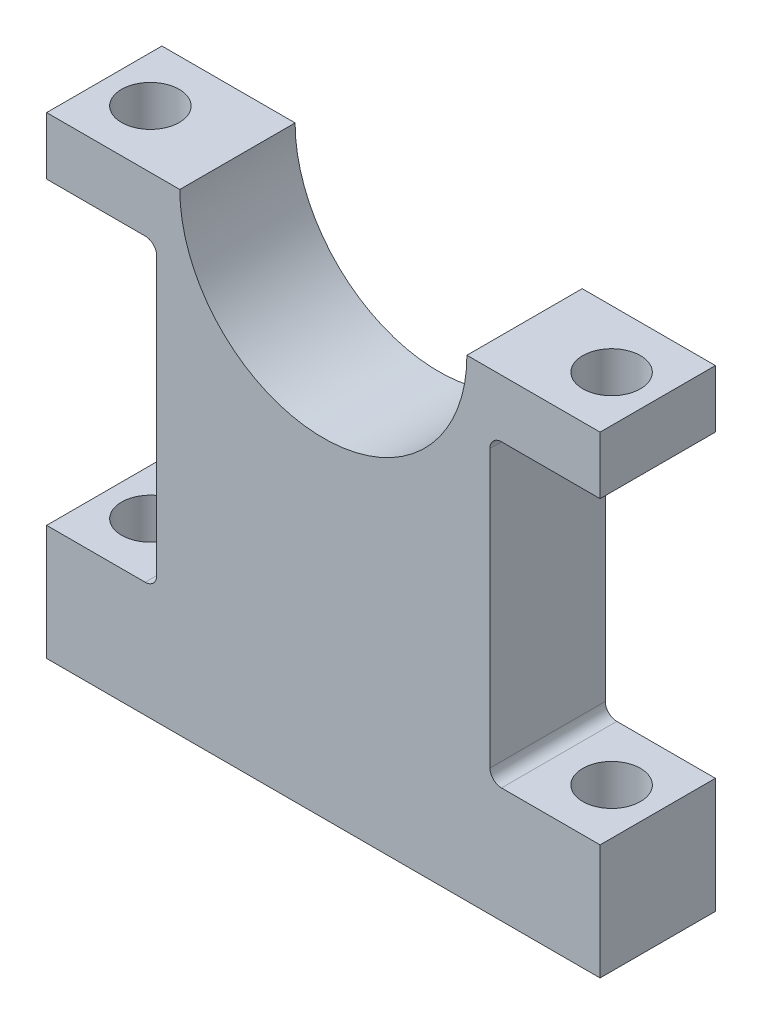
ISO-10303-21;
HEADER;
FILE_DESCRIPTION(('STEP AP214'),'2;1');
FILE_NAME('part.step','',(''),(''),'','','');
FILE_SCHEMA(('AUTOMOTIVE_DESIGN { 1 0 10303 214 1 1 1 1 }'));
ENDSEC;
DATA;
#1=APPLICATION_CONTEXT('core data for automotive mechanical design processes');
#2=APPLICATION_PROTOCOL_DEFINITION('international standard','automotive_design',2000,#1);
#3=PRODUCT_CONTEXT('',#1,'mechanical');
#4=PRODUCT('Part','Part','',(#3));
#5=PRODUCT_RELATED_PRODUCT_CATEGORY('part','',(#4));
#6=PRODUCT_DEFINITION_FORMATION('','',#4);
#7=PRODUCT_DEFINITION_CONTEXT('part definition',#1,'design');
#8=PRODUCT_DEFINITION('design','',#6,#7);
#9=PRODUCT_DEFINITION_SHAPE('','',#8);
#10=(LENGTH_UNIT() NAMED_UNIT(*) SI_UNIT(.MILLI.,.METRE.));
#11=(NAMED_UNIT(*) PLANE_ANGLE_UNIT() SI_UNIT($,.RADIAN.));
#12=(NAMED_UNIT(*) SI_UNIT($,.STERADIAN.) SOLID_ANGLE_UNIT());
#13=UNCERTAINTY_MEASURE_WITH_UNIT(LENGTH_MEASURE(1.E-05),#10,'distance_accuracy_value','');
#14=(GEOMETRIC_REPRESENTATION_CONTEXT(3) GLOBAL_UNCERTAINTY_ASSIGNED_CONTEXT((#13)) GLOBAL_UNIT_ASSIGNED_CONTEXT((#10,
#11,#12)) REPRESENTATION_CONTEXT('',''));
#15=CARTESIAN_POINT('',(0.,0.,0.));
#16=DIRECTION('',(0.,0.,1.));
#17=DIRECTION('',(1.,0.,0.));
#18=AXIS2_PLACEMENT_3D('',#15,#16,#17);
#19=CARTESIAN_POINT('',(0.,0.,0.));
#20=DIRECTION('',(0.,1.,0.));
#21=DIRECTION('',(0.,0.,1.));
#22=AXIS2_PLACEMENT_3D('',#19,#20,#21);
#23=PLANE('',#22);
#24=DIRECTION('',(0.,0.,1.));
#25=VECTOR('',#24,1.);
#26=CARTESIAN_POINT('',(-12.45,0.,-11.));
#27=LINE('',#26,#25);
#28=CARTESIAN_POINT('',(-12.45,0.,-5.));
#29=VERTEX_POINT('',#28);
#30=CARTESIAN_POINT('',(-12.45,0.,5.));
#31=VERTEX_POINT('',#30);
#32=EDGE_CURVE('E178',#29,#31,#27,.T.);
#33=ORIENTED_EDGE('',*,*,#32,.F.);
#34=DIRECTION('',(-1.,0.,0.));
#35=VECTOR('',#34,1.);
#36=CARTESIAN_POINT('',(-24.,0.,-5.));
#37=LINE('',#36,#35);
#38=CARTESIAN_POINT('',(-24.,0.,-5.));
#39=VERTEX_POINT('',#38);
#40=EDGE_CURVE('E351',#29,#39,#37,.T.);
#41=ORIENTED_EDGE('',*,*,#40,.T.);
#42=DIRECTION('',(0.,0.,1.));
#43=VECTOR('',#42,1.);
#44=CARTESIAN_POINT('',(-24.,0.,-5.));
#45=LINE('',#44,#43);
#46=CARTESIAN_POINT('',(-24.,0.,5.));
#47=VERTEX_POINT('',#46);
#48=EDGE_CURVE('E190',#39,#47,#45,.T.);
#49=ORIENTED_EDGE('',*,*,#48,.T.);
#50=DIRECTION('',(1.,0.,0.));
#51=VECTOR('',#50,1.);
#52=CARTESIAN_POINT('',(-24.,0.,5.));
#53=LINE('',#52,#51);
#54=EDGE_CURVE('E166',#47,#31,#53,.T.);
#55=ORIENTED_EDGE('',*,*,#54,.T.);
#56=EDGE_LOOP('',(#33,#41,#49,#55));
#57=FACE_BOUND('',#56,.T.);
#58=CARTESIAN_POINT('',(-20.,0.,0.));
#59=DIRECTION('',(0.,1.,0.));
#60=DIRECTION('',(0.,0.,1.));
#61=AXIS2_PLACEMENT_3D('',#58,#59,#60);
#62=CIRCLE('',#61,2.5);
#63=CARTESIAN_POINT('',(-20.,0.,2.5));
#64=VERTEX_POINT('',#63);
#65=EDGE_CURVE('E389',#64,#64,#62,.T.);
#66=ORIENTED_EDGE('',*,*,#65,.F.);
#67=EDGE_LOOP('',(#66));
#68=FACE_BOUND('',#67,.T.);
#69=ADVANCED_FACE('F39',(#57,#68),#23,.T.);
#70=CARTESIAN_POINT('',(0.,0.,5.));
#71=DIRECTION('',(0.,0.,-1.));
#72=DIRECTION('',(-1.,0.,0.));
#73=AXIS2_PLACEMENT_3D('',#70,#71,#72);
#74=CYLINDRICAL_SURFACE('',#73,12.45);
#75=CARTESIAN_POINT('',(0.,0.,5.));
#76=DIRECTION('',(0.,0.,-1.));
#77=DIRECTION('',(1.,0.,0.));
#78=AXIS2_PLACEMENT_3D('',#75,#76,#77);
#79=CIRCLE('',#78,12.45);
#80=CARTESIAN_POINT('',(12.45,0.,5.));
#81=VERTEX_POINT('',#80);
#82=EDGE_CURVE('E162',#81,#31,#79,.T.);
#83=ORIENTED_EDGE('',*,*,#82,.F.);
#84=DIRECTION('',(0.,0.,1.));
#85=VECTOR('',#84,1.);
#86=CARTESIAN_POINT('',(12.45,0.,-11.));
#87=LINE('',#86,#85);
#88=CARTESIAN_POINT('',(12.45,0.,-5.));
#89=VERTEX_POINT('',#88);
#90=EDGE_CURVE('E185',#81,#89,#87,.F.);
#91=ORIENTED_EDGE('',*,*,#90,.T.);
#92=CARTESIAN_POINT('',(0.,0.,-5.));
#93=DIRECTION('',(0.,0.,-1.));
#94=DIRECTION('',(1.,0.,0.));
#95=AXIS2_PLACEMENT_3D('',#92,#93,#94);
#96=CIRCLE('',#95,12.45);
#97=EDGE_CURVE('E180',#89,#29,#96,.T.);
#98=ORIENTED_EDGE('',*,*,#97,.T.);
#99=ORIENTED_EDGE('',*,*,#32,.T.);
#100=EDGE_LOOP('',(#83,#91,#98,#99));
#101=FACE_BOUND('',#100,.T.);
#102=ADVANCED_FACE('F179',(#101),#74,.F.);
#103=CARTESIAN_POINT('',(12.45,-41.,5.));
#104=DIRECTION('',(0.,1.,0.));
#105=DIRECTION('',(0.,0.,1.));
#106=AXIS2_PLACEMENT_3D('',#103,#104,#105);
#107=PLANE('',#106);
#108=DIRECTION('',(1.,0.,0.));
#109=VECTOR('',#108,1.);
#110=CARTESIAN_POINT('',(12.45,-41.,-5.));
#111=LINE('',#110,#109);
#112=CARTESIAN_POINT('',(-24.,-41.,-5.));
#113=VERTEX_POINT('',#112);
#114=CARTESIAN_POINT('',(24.,-41.,-5.));
#115=VERTEX_POINT('',#114);
#116=EDGE_CURVE('E175',#113,#115,#111,.T.);
#117=ORIENTED_EDGE('',*,*,#116,.T.);
#118=DIRECTION('',(0.,0.,1.));
#119=VECTOR('',#118,1.);
#120=CARTESIAN_POINT('',(24.,-41.,5.));
#121=LINE('',#120,#119);
#122=CARTESIAN_POINT('',(24.,-41.,5.));
#123=VERTEX_POINT('',#122);
#124=EDGE_CURVE('E230',#115,#123,#121,.T.);
#125=ORIENTED_EDGE('',*,*,#124,.T.);
#126=DIRECTION('',(1.,0.,0.));
#127=VECTOR('',#126,1.);
#128=CARTESIAN_POINT('',(12.45,-41.,5.));
#129=LINE('',#128,#127);
#130=CARTESIAN_POINT('',(-24.,-41.,5.));
#131=VERTEX_POINT('',#130);
#132=EDGE_CURVE('E174',#131,#123,#129,.T.);
#133=ORIENTED_EDGE('',*,*,#132,.F.);
#134=DIRECTION('',(0.,0.,-1.));
#135=VECTOR('',#134,1.);
#136=CARTESIAN_POINT('',(-24.,-41.,5.));
#137=LINE('',#136,#135);
#138=EDGE_CURVE('E239',#131,#113,#137,.T.);
#139=ORIENTED_EDGE('',*,*,#138,.T.);
#140=EDGE_LOOP('',(#117,#125,#133,#139));
#141=FACE_BOUND('',#140,.T.);
#142=CARTESIAN_POINT('',(20.,-41.,0.));
#143=DIRECTION('',(0.,-1.,0.));
#144=DIRECTION('',(0.,0.,-1.));
#145=AXIS2_PLACEMENT_3D('',#142,#143,#144);
#146=CIRCLE('',#145,2.5);
#147=CARTESIAN_POINT('',(20.,-41.,-2.5));
#148=VERTEX_POINT('',#147);
#149=EDGE_CURVE('E222',#148,#148,#146,.T.);
#150=ORIENTED_EDGE('',*,*,#149,.F.);
#151=EDGE_LOOP('',(#150));
#152=FACE_BOUND('',#151,.T.);
#153=CARTESIAN_POINT('',(-20.,-41.,0.));
#154=DIRECTION('',(0.,-1.,0.));
#155=DIRECTION('',(0.,0.,1.));
#156=AXIS2_PLACEMENT_3D('',#153,#154,#155);
#157=CIRCLE('',#156,2.5);
#158=CARTESIAN_POINT('',(-20.,-41.,2.5));
#159=VERTEX_POINT('',#158);
#160=EDGE_CURVE('E205',#159,#159,#157,.T.);
#161=ORIENTED_EDGE('',*,*,#160,.F.);
#162=EDGE_LOOP('',(#161));
#163=FACE_BOUND('',#162,.T.);
#164=ADVANCED_FACE('F404',(#141,#152,#163),#107,.F.);
#165=CARTESIAN_POINT('',(0.,0.,5.));
#166=DIRECTION('',(0.,0.,1.));
#167=DIRECTION('',(1.,0.,0.));
#168=AXIS2_PLACEMENT_3D('',#165,#166,#167);
#169=PLANE('',#168);
#170=ORIENTED_EDGE('',*,*,#82,.T.);
#171=ORIENTED_EDGE('',*,*,#54,.F.);
#172=DIRECTION('',(0.,1.,0.));
#173=VECTOR('',#172,1.);
#174=CARTESIAN_POINT('',(-24.,-5.,5.));
#175=LINE('',#174,#173);
#176=CARTESIAN_POINT('',(-24.,-5.,5.));
#177=VERTEX_POINT('',#176);
#178=EDGE_CURVE('E206',#177,#47,#175,.T.);
#179=ORIENTED_EDGE('',*,*,#178,.F.);
#180=DIRECTION('',(1.,0.,0.));
#181=VECTOR('',#180,1.);
#182=CARTESIAN_POINT('',(-24.,-5.,5.));
#183=LINE('',#182,#181);
#184=CARTESIAN_POINT('',(-15.45,-5.,5.));
#185=VERTEX_POINT('',#184);
#186=EDGE_CURVE('E217',#177,#185,#183,.T.);
#187=ORIENTED_EDGE('',*,*,#186,.T.);
#188=CARTESIAN_POINT('',(-15.45,-6.,5.));
#189=DIRECTION('',(0.,0.,1.));
#190=DIRECTION('',(1.,0.,0.));
#191=AXIS2_PLACEMENT_3D('',#188,#189,#190);
#192=CIRCLE('',#191,1.);
#193=CARTESIAN_POINT('',(-14.45,-6.,5.));
#194=VERTEX_POINT('',#193);
#195=EDGE_CURVE('E48',#185,#194,#192,.F.);
#196=ORIENTED_EDGE('',*,*,#195,.T.);
#197=DIRECTION('',(0.,-1.,0.));
#198=VECTOR('',#197,1.);
#199=CARTESIAN_POINT('',(-14.45,-5.,5.));
#200=LINE('',#199,#198);
#201=CARTESIAN_POINT('',(-14.45,-30.,5.));
#202=VERTEX_POINT('',#201);
#203=EDGE_CURVE('E374',#194,#202,#200,.T.);
#204=ORIENTED_EDGE('',*,*,#203,.T.);
#205=CARTESIAN_POINT('',(-15.45,-30.,5.));
#206=DIRECTION('',(0.,0.,1.));
#207=DIRECTION('',(1.,0.,0.));
#208=AXIS2_PLACEMENT_3D('',#205,#206,#207);
#209=CIRCLE('',#208,1.);
#210=CARTESIAN_POINT('',(-15.45,-31.,5.));
#211=VERTEX_POINT('',#210);
#212=EDGE_CURVE('E303',#202,#211,#209,.F.);
#213=ORIENTED_EDGE('',*,*,#212,.T.);
#214=DIRECTION('',(-1.,0.,0.));
#215=VECTOR('',#214,1.);
#216=CARTESIAN_POINT('',(-24.,-31.,5.));
#217=LINE('',#216,#215);
#218=CARTESIAN_POINT('',(-24.,-31.,5.));
#219=VERTEX_POINT('',#218);
#220=EDGE_CURVE('E238',#211,#219,#217,.T.);
#221=ORIENTED_EDGE('',*,*,#220,.T.);
#222=DIRECTION('',(0.,-1.,0.));
#223=VECTOR('',#222,1.);
#224=CARTESIAN_POINT('',(-24.,-31.,5.));
#225=LINE('',#224,#223);
#226=EDGE_CURVE('E268',#219,#131,#225,.T.);
#227=ORIENTED_EDGE('',*,*,#226,.T.);
#228=ORIENTED_EDGE('',*,*,#132,.T.);
#229=DIRECTION('',(0.,-1.,0.));
#230=VECTOR('',#229,1.);
#231=CARTESIAN_POINT('',(24.,-31.,5.));
#232=LINE('',#231,#230);
#233=CARTESIAN_POINT('',(24.,-31.,5.));
#234=VERTEX_POINT('',#233);
#235=EDGE_CURVE('E253',#234,#123,#232,.T.);
#236=ORIENTED_EDGE('',*,*,#235,.F.);
#237=CARTESIAN_POINT('',(15.45,-31.,5.));
#238=VERTEX_POINT('',#237);
#239=EDGE_CURVE('E240',#234,#238,#217,.T.);
#240=ORIENTED_EDGE('',*,*,#239,.T.);
#241=CARTESIAN_POINT('',(15.45,-30.,5.));
#242=DIRECTION('',(0.,0.,1.));
#243=DIRECTION('',(1.,0.,0.));
#244=AXIS2_PLACEMENT_3D('',#241,#242,#243);
#245=CIRCLE('',#244,1.);
#246=CARTESIAN_POINT('',(14.45,-30.,5.));
#247=VERTEX_POINT('',#246);
#248=EDGE_CURVE('E297',#238,#247,#245,.F.);
#249=ORIENTED_EDGE('',*,*,#248,.T.);
#250=DIRECTION('',(0.,1.,0.));
#251=VECTOR('',#250,1.);
#252=CARTESIAN_POINT('',(14.45,-4.99999999999999,5.));
#253=LINE('',#252,#251);
#254=CARTESIAN_POINT('',(14.45,-6.,5.));
#255=VERTEX_POINT('',#254);
#256=EDGE_CURVE('E384',#247,#255,#253,.T.);
#257=ORIENTED_EDGE('',*,*,#256,.T.);
#258=CARTESIAN_POINT('',(15.45,-6.,5.));
#259=DIRECTION('',(0.,0.,1.));
#260=DIRECTION('',(1.,0.,0.));
#261=AXIS2_PLACEMENT_3D('',#258,#259,#260);
#262=CIRCLE('',#261,1.);
#263=CARTESIAN_POINT('',(15.45,-5.,5.));
#264=VERTEX_POINT('',#263);
#265=EDGE_CURVE('E322',#255,#264,#262,.F.);
#266=ORIENTED_EDGE('',*,*,#265,.T.);
#267=CARTESIAN_POINT('',(24.,-5.,5.));
#268=VERTEX_POINT('',#267);
#269=EDGE_CURVE('E332',#264,#268,#183,.T.);
#270=ORIENTED_EDGE('',*,*,#269,.T.);
#271=DIRECTION('',(0.,1.,0.));
#272=VECTOR('',#271,1.);
#273=CARTESIAN_POINT('',(24.,-5.,5.));
#274=LINE('',#273,#272);
#275=CARTESIAN_POINT('',(24.,0.,5.));
#276=VERTEX_POINT('',#275);
#277=EDGE_CURVE('E202',#268,#276,#274,.T.);
#278=ORIENTED_EDGE('',*,*,#277,.T.);
#279=EDGE_CURVE('E169',#81,#276,#53,.T.);
#280=ORIENTED_EDGE('',*,*,#279,.F.);
#281=EDGE_LOOP('',(#170,#171,#179,#187,#196,#204,#213,#221,#227,#228,#236,#240,#249,#257,#266,
#270,#278,#280));
#282=FACE_BOUND('',#281,.T.);
#283=ADVANCED_FACE('F164',(#282),#169,.T.);
#284=CARTESIAN_POINT('',(0.,0.,-5.));
#285=DIRECTION('',(0.,0.,1.));
#286=DIRECTION('',(1.,0.,0.));
#287=AXIS2_PLACEMENT_3D('',#284,#285,#286);
#288=PLANE('',#287);
#289=ORIENTED_EDGE('',*,*,#40,.F.);
#290=ORIENTED_EDGE('',*,*,#97,.F.);
#291=CARTESIAN_POINT('',(24.,0.,-5.));
#292=VERTEX_POINT('',#291);
#293=EDGE_CURVE('E353',#292,#89,#37,.T.);
#294=ORIENTED_EDGE('',*,*,#293,.F.);
#295=DIRECTION('',(0.,1.,0.));
#296=VECTOR('',#295,1.);
#297=CARTESIAN_POINT('',(24.,-5.,-5.));
#298=LINE('',#297,#296);
#299=CARTESIAN_POINT('',(24.,-5.,-5.));
#300=VERTEX_POINT('',#299);
#301=EDGE_CURVE('E213',#300,#292,#298,.T.);
#302=ORIENTED_EDGE('',*,*,#301,.F.);
#303=DIRECTION('',(-1.,0.,0.));
#304=VECTOR('',#303,1.);
#305=CARTESIAN_POINT('',(-24.,-5.,-5.));
#306=LINE('',#305,#304);
#307=CARTESIAN_POINT('',(15.45,-5.,-5.));
#308=VERTEX_POINT('',#307);
#309=EDGE_CURVE('E338',#300,#308,#306,.T.);
#310=ORIENTED_EDGE('',*,*,#309,.T.);
#311=CARTESIAN_POINT('',(15.45,-6.,-5.));
#312=DIRECTION('',(0.,0.,1.));
#313=DIRECTION('',(1.,0.,0.));
#314=AXIS2_PLACEMENT_3D('',#311,#312,#313);
#315=CIRCLE('',#314,1.);
#316=CARTESIAN_POINT('',(14.45,-6.,-5.));
#317=VERTEX_POINT('',#316);
#318=EDGE_CURVE('E325',#308,#317,#315,.T.);
#319=ORIENTED_EDGE('',*,*,#318,.T.);
#320=DIRECTION('',(0.,-1.,0.));
#321=VECTOR('',#320,1.);
#322=CARTESIAN_POINT('',(14.45,-4.99999999999999,-5.));
#323=LINE('',#322,#321);
#324=CARTESIAN_POINT('',(14.45,-30.,-5.));
#325=VERTEX_POINT('',#324);
#326=EDGE_CURVE('E381',#317,#325,#323,.T.);
#327=ORIENTED_EDGE('',*,*,#326,.T.);
#328=CARTESIAN_POINT('',(15.45,-30.,-5.));
#329=DIRECTION('',(0.,0.,1.));
#330=DIRECTION('',(1.,0.,0.));
#331=AXIS2_PLACEMENT_3D('',#328,#329,#330);
#332=CIRCLE('',#331,1.);
#333=CARTESIAN_POINT('',(15.45,-31.,-5.));
#334=VERTEX_POINT('',#333);
#335=EDGE_CURVE('E300',#325,#334,#332,.T.);
#336=ORIENTED_EDGE('',*,*,#335,.T.);
#337=DIRECTION('',(1.,0.,0.));
#338=VECTOR('',#337,1.);
#339=CARTESIAN_POINT('',(-24.,-31.,-5.));
#340=LINE('',#339,#338);
#341=CARTESIAN_POINT('',(24.,-31.,-5.));
#342=VERTEX_POINT('',#341);
#343=EDGE_CURVE('E248',#334,#342,#340,.T.);
#344=ORIENTED_EDGE('',*,*,#343,.T.);
#345=DIRECTION('',(0.,-1.,0.));
#346=VECTOR('',#345,1.);
#347=CARTESIAN_POINT('',(24.,-31.,-5.));
#348=LINE('',#347,#346);
#349=EDGE_CURVE('E260',#342,#115,#348,.T.);
#350=ORIENTED_EDGE('',*,*,#349,.T.);
#351=ORIENTED_EDGE('',*,*,#116,.F.);
#352=DIRECTION('',(0.,-1.,0.));
#353=VECTOR('',#352,1.);
#354=CARTESIAN_POINT('',(-24.,-31.,-5.));
#355=LINE('',#354,#353);
#356=CARTESIAN_POINT('',(-24.,-31.,-5.));
#357=VERTEX_POINT('',#356);
#358=EDGE_CURVE('E264',#357,#113,#355,.T.);
#359=ORIENTED_EDGE('',*,*,#358,.F.);
#360=CARTESIAN_POINT('',(-15.45,-31.,-5.));
#361=VERTEX_POINT('',#360);
#362=EDGE_CURVE('E249',#357,#361,#340,.T.);
#363=ORIENTED_EDGE('',*,*,#362,.T.);
#364=CARTESIAN_POINT('',(-15.45,-30.,-5.));
#365=DIRECTION('',(0.,0.,1.));
#366=DIRECTION('',(1.,0.,0.));
#367=AXIS2_PLACEMENT_3D('',#364,#365,#366);
#368=CIRCLE('',#367,1.);
#369=CARTESIAN_POINT('',(-14.45,-30.,-5.));
#370=VERTEX_POINT('',#369);
#371=EDGE_CURVE('E306',#361,#370,#368,.T.);
#372=ORIENTED_EDGE('',*,*,#371,.T.);
#373=DIRECTION('',(0.,1.,0.));
#374=VECTOR('',#373,1.);
#375=CARTESIAN_POINT('',(-14.45,-5.,-5.));
#376=LINE('',#375,#374);
#377=CARTESIAN_POINT('',(-14.45,-6.,-5.));
#378=VERTEX_POINT('',#377);
#379=EDGE_CURVE('E369',#370,#378,#376,.T.);
#380=ORIENTED_EDGE('',*,*,#379,.T.);
#381=CARTESIAN_POINT('',(-15.45,-6.,-5.));
#382=DIRECTION('',(0.,0.,1.));
#383=DIRECTION('',(1.,0.,0.));
#384=AXIS2_PLACEMENT_3D('',#381,#382,#383);
#385=CIRCLE('',#384,1.);
#386=CARTESIAN_POINT('',(-15.45,-5.,-5.));
#387=VERTEX_POINT('',#386);
#388=EDGE_CURVE('E11',#378,#387,#385,.T.);
#389=ORIENTED_EDGE('',*,*,#388,.T.);
#390=CARTESIAN_POINT('',(-24.,-5.,-5.));
#391=VERTEX_POINT('',#390);
#392=EDGE_CURVE('E197',#387,#391,#306,.T.);
#393=ORIENTED_EDGE('',*,*,#392,.T.);
#394=DIRECTION('',(0.,1.,0.));
#395=VECTOR('',#394,1.);
#396=CARTESIAN_POINT('',(-24.,-5.,-5.));
#397=LINE('',#396,#395);
#398=EDGE_CURVE('E209',#391,#39,#397,.T.);
#399=ORIENTED_EDGE('',*,*,#398,.T.);
#400=EDGE_LOOP('',(#289,#290,#294,#302,#310,#319,#327,#336,#344,#350,#351,#359,#363,#372,#380,
#389,#393,#399));
#401=FACE_BOUND('',#400,.T.);
#402=ADVANCED_FACE('F359',(#401),#288,.F.);
#403=CARTESIAN_POINT('',(24.,-31.,5.));
#404=DIRECTION('',(1.,0.,0.));
#405=DIRECTION('',(0.,0.,-1.));
#406=AXIS2_PLACEMENT_3D('',#403,#404,#405);
#407=PLANE('',#406);
#408=ORIENTED_EDGE('',*,*,#124,.F.);
#409=ORIENTED_EDGE('',*,*,#349,.F.);
#410=DIRECTION('',(0.,0.,1.));
#411=VECTOR('',#410,1.);
#412=CARTESIAN_POINT('',(24.,-31.,5.));
#413=LINE('',#412,#411);
#414=EDGE_CURVE('E234',#342,#234,#413,.T.);
#415=ORIENTED_EDGE('',*,*,#414,.T.);
#416=ORIENTED_EDGE('',*,*,#235,.T.);
#417=EDGE_LOOP('',(#408,#409,#415,#416));
#418=FACE_BOUND('',#417,.T.);
#419=ADVANCED_FACE('F459',(#418),#407,.T.);
#420=CARTESIAN_POINT('',(20.,-31.,0.));
#421=DIRECTION('',(0.,-1.,0.));
#422=DIRECTION('',(0.,0.,-1.));
#423=AXIS2_PLACEMENT_3D('',#420,#421,#422);
#424=CYLINDRICAL_SURFACE('',#423,2.5);
#425=CARTESIAN_POINT('',(20.,-31.,0.));
#426=DIRECTION('',(0.,-1.,0.));
#427=DIRECTION('',(0.,0.,-1.));
#428=AXIS2_PLACEMENT_3D('',#425,#426,#427);
#429=CIRCLE('',#428,2.5);
#430=CARTESIAN_POINT('',(20.,-31.,-2.5));
#431=VERTEX_POINT('',#430);
#432=EDGE_CURVE('E226',#431,#431,#429,.T.);
#433=ORIENTED_EDGE('',*,*,#432,.F.);
#434=EDGE_LOOP('',(#433));
#435=FACE_BOUND('',#434,.T.);
#436=ORIENTED_EDGE('',*,*,#149,.T.);
#437=EDGE_LOOP('',(#436));
#438=FACE_BOUND('',#437,.T.);
#439=ADVANCED_FACE('F455',(#435,#438),#424,.F.);
#440=CARTESIAN_POINT('',(0.,-31.,0.));
#441=DIRECTION('',(0.,-1.,0.));
#442=DIRECTION('',(0.,0.,-1.));
#443=AXIS2_PLACEMENT_3D('',#440,#441,#442);
#444=PLANE('',#443);
#445=ORIENTED_EDGE('',*,*,#432,.T.);
#446=EDGE_LOOP('',(#445));
#447=FACE_BOUND('',#446,.T.);
#448=ORIENTED_EDGE('',*,*,#343,.F.);
#449=DIRECTION('',(0.,0.,1.));
#450=VECTOR('',#449,1.);
#451=CARTESIAN_POINT('',(15.45,-31.,0.));
#452=LINE('',#451,#450);
#453=EDGE_CURVE('E184',#334,#238,#452,.T.);
#454=ORIENTED_EDGE('',*,*,#453,.T.);
#455=ORIENTED_EDGE('',*,*,#239,.F.);
#456=ORIENTED_EDGE('',*,*,#414,.F.);
#457=EDGE_LOOP('',(#448,#454,#455,#456));
#458=FACE_BOUND('',#457,.T.);
#459=ADVANCED_FACE('F458',(#447,#458),#444,.F.);
#460=CARTESIAN_POINT('',(-20.,-31.,0.));
#461=DIRECTION('',(0.,-1.,0.));
#462=DIRECTION('',(0.,0.,1.));
#463=AXIS2_PLACEMENT_3D('',#460,#461,#462);
#464=CIRCLE('',#463,2.5);
#465=CARTESIAN_POINT('',(-20.,-31.,2.5));
#466=VERTEX_POINT('',#465);
#467=EDGE_CURVE('E218',#466,#466,#464,.T.);
#468=ORIENTED_EDGE('',*,*,#467,.T.);
#469=EDGE_LOOP('',(#468));
#470=FACE_BOUND('',#469,.T.);
#471=ORIENTED_EDGE('',*,*,#220,.F.);
#472=DIRECTION('',(0.,0.,1.));
#473=VECTOR('',#472,1.);
#474=CARTESIAN_POINT('',(-15.45,-31.,0.));
#475=LINE('',#474,#473);
#476=EDGE_CURVE('E294',#211,#361,#475,.F.);
#477=ORIENTED_EDGE('',*,*,#476,.T.);
#478=ORIENTED_EDGE('',*,*,#362,.F.);
#479=DIRECTION('',(0.,0.,-1.));
#480=VECTOR('',#479,1.);
#481=CARTESIAN_POINT('',(-24.,-31.,5.));
#482=LINE('',#481,#480);
#483=EDGE_CURVE('E244',#219,#357,#482,.T.);
#484=ORIENTED_EDGE('',*,*,#483,.F.);
#485=EDGE_LOOP('',(#471,#477,#478,#484));
#486=FACE_BOUND('',#485,.T.);
#487=ADVANCED_FACE('F449',(#470,#486),#444,.F.);
#488=CARTESIAN_POINT('',(-24.,-31.,5.));
#489=DIRECTION('',(-1.,0.,0.));
#490=DIRECTION('',(0.,0.,1.));
#491=AXIS2_PLACEMENT_3D('',#488,#489,#490);
#492=PLANE('',#491);
#493=ORIENTED_EDGE('',*,*,#138,.F.);
#494=ORIENTED_EDGE('',*,*,#226,.F.);
#495=ORIENTED_EDGE('',*,*,#483,.T.);
#496=ORIENTED_EDGE('',*,*,#358,.T.);
#497=EDGE_LOOP('',(#493,#494,#495,#496));
#498=FACE_BOUND('',#497,.T.);
#499=ADVANCED_FACE('F442',(#498),#492,.T.);
#500=CARTESIAN_POINT('',(-20.,-31.,0.));
#501=DIRECTION('',(0.,-1.,0.));
#502=DIRECTION('',(0.,0.,-1.));
#503=AXIS2_PLACEMENT_3D('',#500,#501,#502);
#504=CYLINDRICAL_SURFACE('',#503,2.5);
#505=ORIENTED_EDGE('',*,*,#467,.F.);
#506=EDGE_LOOP('',(#505));
#507=FACE_BOUND('',#506,.T.);
#508=ORIENTED_EDGE('',*,*,#160,.T.);
#509=EDGE_LOOP('',(#508));
#510=FACE_BOUND('',#509,.T.);
#511=ADVANCED_FACE('F437',(#507,#510),#504,.F.);
#512=CARTESIAN_POINT('',(0.,-5.,0.));
#513=DIRECTION('',(0.,1.,0.));
#514=DIRECTION('',(0.,0.,1.));
#515=AXIS2_PLACEMENT_3D('',#512,#513,#514);
#516=PLANE('',#515);
#517=CARTESIAN_POINT('',(-20.,-5.,0.));
#518=DIRECTION('',(0.,1.,0.));
#519=DIRECTION('',(0.,0.,1.));
#520=AXIS2_PLACEMENT_3D('',#517,#518,#519);
#521=CIRCLE('',#520,2.5);
#522=CARTESIAN_POINT('',(-20.,-5.,2.5));
#523=VERTEX_POINT('',#522);
#524=EDGE_CURVE('E352',#523,#523,#521,.T.);
#525=ORIENTED_EDGE('',*,*,#524,.T.);
#526=EDGE_LOOP('',(#525));
#527=FACE_BOUND('',#526,.T.);
#528=ORIENTED_EDGE('',*,*,#392,.F.);
#529=DIRECTION('',(0.,0.,1.));
#530=VECTOR('',#529,1.);
#531=CARTESIAN_POINT('',(-15.45,-5.,0.));
#532=LINE('',#531,#530);
#533=EDGE_CURVE('E316',#387,#185,#532,.T.);
#534=ORIENTED_EDGE('',*,*,#533,.T.);
#535=ORIENTED_EDGE('',*,*,#186,.F.);
#536=DIRECTION('',(0.,0.,1.));
#537=VECTOR('',#536,1.);
#538=CARTESIAN_POINT('',(-24.,-5.,-5.));
#539=LINE('',#538,#537);
#540=EDGE_CURVE('E335',#391,#177,#539,.T.);
#541=ORIENTED_EDGE('',*,*,#540,.F.);
#542=EDGE_LOOP('',(#528,#534,#535,#541));
#543=FACE_BOUND('',#542,.T.);
#544=ADVANCED_FACE('F365',(#527,#543),#516,.F.);
#545=CARTESIAN_POINT('',(20.,-5.,0.));
#546=DIRECTION('',(0.,1.,0.));
#547=DIRECTION('',(0.,0.,1.));
#548=AXIS2_PLACEMENT_3D('',#545,#546,#547);
#549=CIRCLE('',#548,2.5);
#550=CARTESIAN_POINT('',(20.,-5.,2.5));
#551=VERTEX_POINT('',#550);
#552=EDGE_CURVE('E379',#551,#551,#549,.T.);
#553=ORIENTED_EDGE('',*,*,#552,.T.);
#554=EDGE_LOOP('',(#553));
#555=FACE_BOUND('',#554,.T.);
#556=ORIENTED_EDGE('',*,*,#269,.F.);
#557=DIRECTION('',(0.,0.,1.));
#558=VECTOR('',#557,1.);
#559=CARTESIAN_POINT('',(15.45,-5.,0.));
#560=LINE('',#559,#558);
#561=EDGE_CURVE('E313',#264,#308,#560,.F.);
#562=ORIENTED_EDGE('',*,*,#561,.T.);
#563=ORIENTED_EDGE('',*,*,#309,.F.);
#564=DIRECTION('',(0.,0.,-1.));
#565=VECTOR('',#564,1.);
#566=CARTESIAN_POINT('',(24.,-5.,-5.));
#567=LINE('',#566,#565);
#568=EDGE_CURVE('E192',#268,#300,#567,.T.);
#569=ORIENTED_EDGE('',*,*,#568,.F.);
#570=EDGE_LOOP('',(#556,#562,#563,#569));
#571=FACE_BOUND('',#570,.T.);
#572=ADVANCED_FACE('F410',(#555,#571),#516,.F.);
#573=ORIENTED_EDGE('',*,*,#90,.F.);
#574=ORIENTED_EDGE('',*,*,#279,.T.);
#575=DIRECTION('',(0.,0.,-1.));
#576=VECTOR('',#575,1.);
#577=CARTESIAN_POINT('',(24.,0.,-5.));
#578=LINE('',#577,#576);
#579=EDGE_CURVE('E348',#276,#292,#578,.T.);
#580=ORIENTED_EDGE('',*,*,#579,.T.);
#581=ORIENTED_EDGE('',*,*,#293,.T.);
#582=EDGE_LOOP('',(#573,#574,#580,#581));
#583=FACE_BOUND('',#582,.T.);
#584=CARTESIAN_POINT('',(20.,0.,0.));
#585=DIRECTION('',(0.,1.,0.));
#586=DIRECTION('',(0.,0.,1.));
#587=AXIS2_PLACEMENT_3D('',#584,#585,#586);
#588=CIRCLE('',#587,2.5);
#589=CARTESIAN_POINT('',(20.,0.,2.5));
#590=VERTEX_POINT('',#589);
#591=EDGE_CURVE('E373',#590,#590,#588,.T.);
#592=ORIENTED_EDGE('',*,*,#591,.F.);
#593=EDGE_LOOP('',(#592));
#594=FACE_BOUND('',#593,.T.);
#595=ADVANCED_FACE('F400',(#583,#594),#23,.T.);
#596=CARTESIAN_POINT('',(24.,-5.,-5.));
#597=DIRECTION('',(1.,0.,0.));
#598=DIRECTION('',(0.,0.,-1.));
#599=AXIS2_PLACEMENT_3D('',#596,#597,#598);
#600=PLANE('',#599);
#601=ORIENTED_EDGE('',*,*,#579,.F.);
#602=ORIENTED_EDGE('',*,*,#277,.F.);
#603=ORIENTED_EDGE('',*,*,#568,.T.);
#604=ORIENTED_EDGE('',*,*,#301,.T.);
#605=EDGE_LOOP('',(#601,#602,#603,#604));
#606=FACE_BOUND('',#605,.T.);
#607=ADVANCED_FACE('F409',(#606),#600,.T.);
#608=CARTESIAN_POINT('',(-24.,-5.,-5.));
#609=DIRECTION('',(-1.,0.,0.));
#610=DIRECTION('',(0.,0.,1.));
#611=AXIS2_PLACEMENT_3D('',#608,#609,#610);
#612=PLANE('',#611);
#613=ORIENTED_EDGE('',*,*,#48,.F.);
#614=ORIENTED_EDGE('',*,*,#398,.F.);
#615=ORIENTED_EDGE('',*,*,#540,.T.);
#616=ORIENTED_EDGE('',*,*,#178,.T.);
#617=EDGE_LOOP('',(#613,#614,#615,#616));
#618=FACE_BOUND('',#617,.T.);
#619=ADVANCED_FACE('F362',(#618),#612,.T.);
#620=CARTESIAN_POINT('',(-20.,-5.,0.));
#621=DIRECTION('',(0.,1.,0.));
#622=DIRECTION('',(0.,0.,1.));
#623=AXIS2_PLACEMENT_3D('',#620,#621,#622);
#624=CYLINDRICAL_SURFACE('',#623,2.5);
#625=ORIENTED_EDGE('',*,*,#524,.F.);
#626=EDGE_LOOP('',(#625));
#627=FACE_BOUND('',#626,.T.);
#628=ORIENTED_EDGE('',*,*,#65,.T.);
#629=EDGE_LOOP('',(#628));
#630=FACE_BOUND('',#629,.T.);
#631=ADVANCED_FACE('F397',(#627,#630),#624,.F.);
#632=CARTESIAN_POINT('',(20.,-5.,0.));
#633=DIRECTION('',(0.,1.,0.));
#634=DIRECTION('',(0.,0.,1.));
#635=AXIS2_PLACEMENT_3D('',#632,#633,#634);
#636=CYLINDRICAL_SURFACE('',#635,2.5);
#637=ORIENTED_EDGE('',*,*,#552,.F.);
#638=EDGE_LOOP('',(#637));
#639=FACE_BOUND('',#638,.T.);
#640=ORIENTED_EDGE('',*,*,#591,.T.);
#641=EDGE_LOOP('',(#640));
#642=FACE_BOUND('',#641,.T.);
#643=ADVANCED_FACE('F421',(#639,#642),#636,.F.);
#644=CARTESIAN_POINT('',(-14.45,-5.,-31.0768096208106));
#645=DIRECTION('',(-1.,0.,0.));
#646=DIRECTION('',(0.,-1.,0.));
#647=AXIS2_PLACEMENT_3D('',#644,#645,#646);
#648=PLANE('',#647);
#649=ORIENTED_EDGE('',*,*,#203,.F.);
#650=DIRECTION('',(0.,0.,1.));
#651=VECTOR('',#650,1.);
#652=CARTESIAN_POINT('',(-14.45,-6.,-31.0768096208106));
#653=LINE('',#652,#651);
#654=EDGE_CURVE('E61',#194,#378,#653,.F.);
#655=ORIENTED_EDGE('',*,*,#654,.T.);
#656=ORIENTED_EDGE('',*,*,#379,.F.);
#657=DIRECTION('',(0.,0.,1.));
#658=VECTOR('',#657,1.);
#659=CARTESIAN_POINT('',(-14.45,-30.,-31.0768096208106));
#660=LINE('',#659,#658);
#661=EDGE_CURVE('E290',#370,#202,#660,.T.);
#662=ORIENTED_EDGE('',*,*,#661,.T.);
#663=EDGE_LOOP('',(#649,#655,#656,#662));
#664=FACE_BOUND('',#663,.T.);
#665=ADVANCED_FACE('F423',(#664),#648,.T.);
#666=CARTESIAN_POINT('',(14.45,-4.99999999999999,-31.0768096208106));
#667=DIRECTION('',(1.,0.,0.));
#668=DIRECTION('',(0.,1.,0.));
#669=AXIS2_PLACEMENT_3D('',#666,#667,#668);
#670=PLANE('',#669);
#671=ORIENTED_EDGE('',*,*,#326,.F.);
#672=DIRECTION('',(0.,0.,1.));
#673=VECTOR('',#672,1.);
#674=CARTESIAN_POINT('',(14.45,-6.,-31.0768096208106));
#675=LINE('',#674,#673);
#676=EDGE_CURVE('E309',#317,#255,#675,.T.);
#677=ORIENTED_EDGE('',*,*,#676,.T.);
#678=ORIENTED_EDGE('',*,*,#256,.F.);
#679=DIRECTION('',(0.,0.,1.));
#680=VECTOR('',#679,1.);
#681=CARTESIAN_POINT('',(14.45,-30.,-31.0768096208106));
#682=LINE('',#681,#680);
#683=EDGE_CURVE('E286',#247,#325,#682,.F.);
#684=ORIENTED_EDGE('',*,*,#683,.T.);
#685=EDGE_LOOP('',(#671,#677,#678,#684));
#686=FACE_BOUND('',#685,.T.);
#687=ADVANCED_FACE('F430',(#686),#670,.T.);
#688=CARTESIAN_POINT('',(15.45,-30.,0.));
#689=DIRECTION('',(0.,0.,1.));
#690=DIRECTION('',(1.,0.,0.));
#691=AXIS2_PLACEMENT_3D('',#688,#689,#690);
#692=CYLINDRICAL_SURFACE('',#691,1.);
#693=ORIENTED_EDGE('',*,*,#335,.F.);
#694=ORIENTED_EDGE('',*,*,#683,.F.);
#695=ORIENTED_EDGE('',*,*,#248,.F.);
#696=ORIENTED_EDGE('',*,*,#453,.F.);
#697=EDGE_LOOP('',(#693,#694,#695,#696));
#698=FACE_BOUND('',#697,.T.);
#699=ADVANCED_FACE('F474',(#698),#692,.F.);
#700=CARTESIAN_POINT('',(-15.45,-30.,-31.0768096208106));
#701=DIRECTION('',(0.,0.,1.));
#702=DIRECTION('',(1.,0.,0.));
#703=AXIS2_PLACEMENT_3D('',#700,#701,#702);
#704=CYLINDRICAL_SURFACE('',#703,1.);
#705=ORIENTED_EDGE('',*,*,#371,.F.);
#706=ORIENTED_EDGE('',*,*,#476,.F.);
#707=ORIENTED_EDGE('',*,*,#212,.F.);
#708=ORIENTED_EDGE('',*,*,#661,.F.);
#709=EDGE_LOOP('',(#705,#706,#707,#708));
#710=FACE_BOUND('',#709,.T.);
#711=ADVANCED_FACE('F477',(#710),#704,.F.);
#712=CARTESIAN_POINT('',(15.45,-6.,-31.0768096208106));
#713=DIRECTION('',(0.,0.,1.));
#714=DIRECTION('',(1.,0.,0.));
#715=AXIS2_PLACEMENT_3D('',#712,#713,#714);
#716=CYLINDRICAL_SURFACE('',#715,1.);
#717=ORIENTED_EDGE('',*,*,#318,.F.);
#718=ORIENTED_EDGE('',*,*,#561,.F.);
#719=ORIENTED_EDGE('',*,*,#265,.F.);
#720=ORIENTED_EDGE('',*,*,#676,.F.);
#721=EDGE_LOOP('',(#717,#718,#719,#720));
#722=FACE_BOUND('',#721,.T.);
#723=ADVANCED_FACE('F480',(#722),#716,.F.);
#724=CARTESIAN_POINT('',(-15.45,-6.,0.));
#725=DIRECTION('',(0.,0.,1.));
#726=DIRECTION('',(1.,0.,0.));
#727=AXIS2_PLACEMENT_3D('',#724,#725,#726);
#728=CYLINDRICAL_SURFACE('',#727,1.);
#729=ORIENTED_EDGE('',*,*,#388,.F.);
#730=ORIENTED_EDGE('',*,*,#654,.F.);
#731=ORIENTED_EDGE('',*,*,#195,.F.);
#732=ORIENTED_EDGE('',*,*,#533,.F.);
#733=EDGE_LOOP('',(#729,#730,#731,#732));
#734=FACE_BOUND('',#733,.T.);
#735=ADVANCED_FACE('F41',(#734),#728,.F.);
#736=CLOSED_SHELL('',(#69,#102,#164,#283,#402,#419,#439,#459,#487,#499,#511,#544,#572,#595,#607,
#619,#631,#643,#665,#687,#699,#711,#723,#735));
#737=MANIFOLD_SOLID_BREP('B2',#736);
#738=ADVANCED_BREP_SHAPE_REPRESENTATION('',(#18,#737),#14);
#739=SHAPE_DEFINITION_REPRESENTATION(#9,#738);
ENDSEC;
END-ISO-10303-21;
